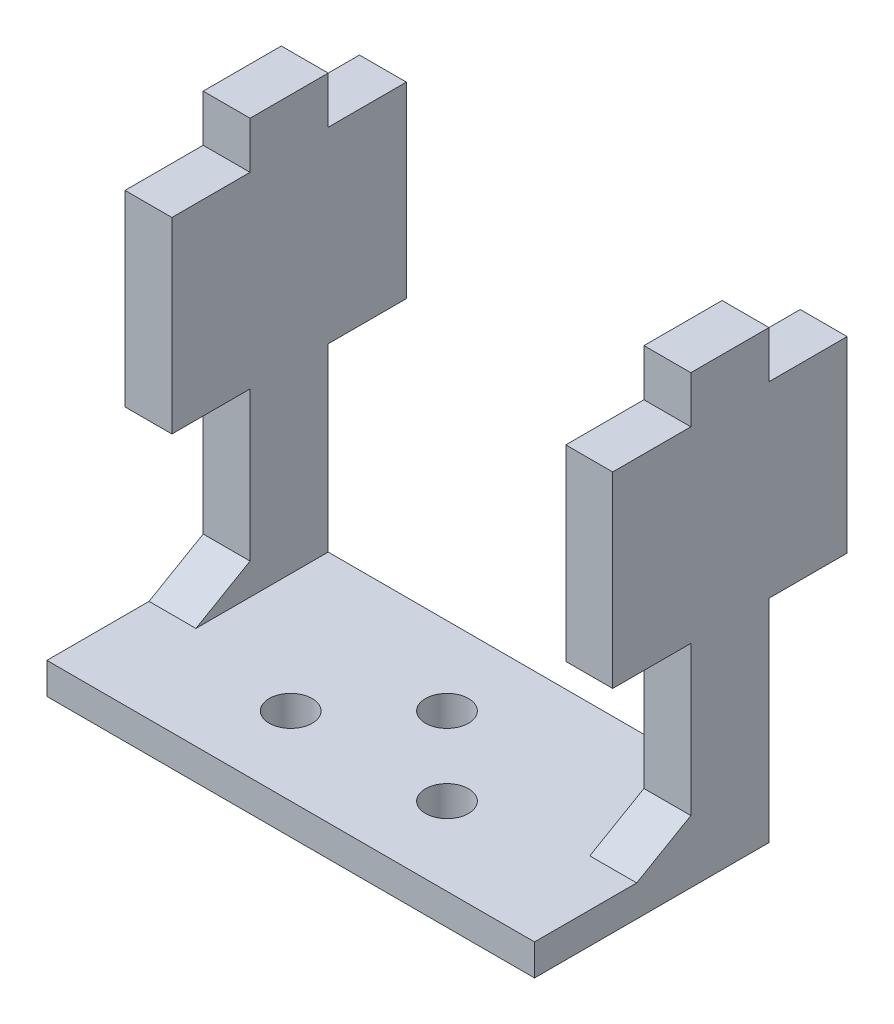
ISO-10303-21;
HEADER;
FILE_DESCRIPTION(('STEP AP214'),'2;1');
FILE_NAME('part.step','',(''),(''),'','','');
FILE_SCHEMA(('AUTOMOTIVE_DESIGN { 1 0 10303 214 1 1 1 1 }'));
ENDSEC;
DATA;
#1=APPLICATION_CONTEXT('core data for automotive mechanical design processes');
#2=APPLICATION_PROTOCOL_DEFINITION('international standard','automotive_design',2000,#1);
#3=PRODUCT_CONTEXT('',#1,'mechanical');
#4=PRODUCT('Part','Part','',(#3));
#5=PRODUCT_RELATED_PRODUCT_CATEGORY('part','',(#4));
#6=PRODUCT_DEFINITION_FORMATION('','',#4);
#7=PRODUCT_DEFINITION_CONTEXT('part definition',#1,'design');
#8=PRODUCT_DEFINITION('design','',#6,#7);
#9=PRODUCT_DEFINITION_SHAPE('','',#8);
#10=(LENGTH_UNIT() NAMED_UNIT(*) SI_UNIT(.MILLI.,.METRE.));
#11=(NAMED_UNIT(*) PLANE_ANGLE_UNIT() SI_UNIT($,.RADIAN.));
#12=(NAMED_UNIT(*) SI_UNIT($,.STERADIAN.) SOLID_ANGLE_UNIT());
#13=UNCERTAINTY_MEASURE_WITH_UNIT(LENGTH_MEASURE(1.E-05),#10,'distance_accuracy_value','');
#14=(GEOMETRIC_REPRESENTATION_CONTEXT(3) GLOBAL_UNCERTAINTY_ASSIGNED_CONTEXT((#13)) GLOBAL_UNIT_ASSIGNED_CONTEXT((#10,
#11,#12)) REPRESENTATION_CONTEXT('',''));
#15=CARTESIAN_POINT('',(0.,0.,0.));
#16=DIRECTION('',(0.,0.,1.));
#17=DIRECTION('',(1.,0.,0.));
#18=AXIS2_PLACEMENT_3D('',#15,#16,#17);
#19=CARTESIAN_POINT('',(0.,2.,0.));
#20=DIRECTION('',(0.,-1.,0.));
#21=DIRECTION('',(0.,0.,-1.));
#22=AXIS2_PLACEMENT_3D('',#19,#20,#21);
#23=PLANE('',#22);
#24=CARTESIAN_POINT('',(20.6,2.,-5.));
#25=DIRECTION('',(0.,1.,0.));
#26=DIRECTION('',(0.,0.,1.));
#27=AXIS2_PLACEMENT_3D('',#24,#25,#26);
#28=CIRCLE('',#27,1.375);
#29=CARTESIAN_POINT('',(20.6,2.,-3.625));
#30=VERTEX_POINT('',#29);
#31=EDGE_CURVE('E252',#30,#30,#28,.T.);
#32=ORIENTED_EDGE('',*,*,#31,.F.);
#33=EDGE_LOOP('',(#32));
#34=FACE_BOUND('',#33,.T.);
#35=CARTESIAN_POINT('',(10.6,2.,-5.));
#36=DIRECTION('',(0.,1.,0.));
#37=DIRECTION('',(0.,0.,1.));
#38=AXIS2_PLACEMENT_3D('',#35,#36,#37);
#39=CIRCLE('',#38,1.375);
#40=CARTESIAN_POINT('',(10.6,2.,-3.625));
#41=VERTEX_POINT('',#40);
#42=EDGE_CURVE('E258',#41,#41,#39,.T.);
#43=ORIENTED_EDGE('',*,*,#42,.F.);
#44=EDGE_LOOP('',(#43));
#45=FACE_BOUND('',#44,.T.);
#46=CARTESIAN_POINT('',(15.6,2.,-10.));
#47=DIRECTION('',(0.,1.,0.));
#48=DIRECTION('',(0.,0.,1.));
#49=AXIS2_PLACEMENT_3D('',#46,#47,#48);
#50=CIRCLE('',#49,1.375);
#51=CARTESIAN_POINT('',(15.6,2.,-8.625));
#52=VERTEX_POINT('',#51);
#53=EDGE_CURVE('E264',#52,#52,#50,.T.);
#54=ORIENTED_EDGE('',*,*,#53,.F.);
#55=EDGE_LOOP('',(#54));
#56=FACE_BOUND('',#55,.T.);
#57=DIRECTION('',(-1.,0.,0.));
#58=VECTOR('',#57,1.);
#59=CARTESIAN_POINT('',(7.00000000000006,2.,-6.53589838486217));
#60=LINE('',#59,#58);
#61=CARTESIAN_POINT('',(3.,2.,-6.53589838486217));
#62=VERTEX_POINT('',#61);
#63=CARTESIAN_POINT('',(0.,2.,-6.53589838486217));
#64=VERTEX_POINT('',#63);
#65=EDGE_CURVE('E229',#62,#64,#60,.T.);
#66=ORIENTED_EDGE('',*,*,#65,.T.);
#67=DIRECTION('',(0.,0.,1.));
#68=VECTOR('',#67,1.);
#69=CARTESIAN_POINT('',(0.,2.,0.));
#70=LINE('',#69,#68);
#71=CARTESIAN_POINT('',(0.,2.,0.));
#72=VERTEX_POINT('',#71);
#73=EDGE_CURVE('E237',#64,#72,#70,.T.);
#74=ORIENTED_EDGE('',*,*,#73,.T.);
#75=DIRECTION('',(1.,0.,0.));
#76=VECTOR('',#75,1.);
#77=CARTESIAN_POINT('',(0.,2.,0.));
#78=LINE('',#77,#76);
#79=CARTESIAN_POINT('',(31.2,2.,0.));
#80=VERTEX_POINT('',#79);
#81=EDGE_CURVE('E271',#72,#80,#78,.T.);
#82=ORIENTED_EDGE('',*,*,#81,.T.);
#83=DIRECTION('',(0.,0.,-1.));
#84=VECTOR('',#83,1.);
#85=CARTESIAN_POINT('',(31.2,2.,0.));
#86=LINE('',#85,#84);
#87=CARTESIAN_POINT('',(31.2,2.,-6.53589838486217));
#88=VERTEX_POINT('',#87);
#89=EDGE_CURVE('E55',#80,#88,#86,.T.);
#90=ORIENTED_EDGE('',*,*,#89,.T.);
#91=DIRECTION('',(1.,0.,0.));
#92=VECTOR('',#91,1.);
#93=CARTESIAN_POINT('',(24.1999999999999,2.,-6.53589838486217));
#94=LINE('',#93,#92);
#95=CARTESIAN_POINT('',(28.2,2.,-6.53589838486217));
#96=VERTEX_POINT('',#95);
#97=EDGE_CURVE('E367',#96,#88,#94,.T.);
#98=ORIENTED_EDGE('',*,*,#97,.F.);
#99=DIRECTION('',(0.,0.,1.));
#100=VECTOR('',#99,1.);
#101=CARTESIAN_POINT('',(28.2,2.,-15.));
#102=LINE('',#101,#100);
#103=CARTESIAN_POINT('',(28.2,2.,-15.));
#104=VERTEX_POINT('',#103);
#105=EDGE_CURVE('E48',#104,#96,#102,.T.);
#106=ORIENTED_EDGE('',*,*,#105,.F.);
#107=DIRECTION('',(-1.,0.,0.));
#108=VECTOR('',#107,1.);
#109=CARTESIAN_POINT('',(0.,2.,-15.));
#110=LINE('',#109,#108);
#111=CARTESIAN_POINT('',(3.,2.,-15.));
#112=VERTEX_POINT('',#111);
#113=EDGE_CURVE('E275',#104,#112,#110,.T.);
#114=ORIENTED_EDGE('',*,*,#113,.T.);
#115=DIRECTION('',(0.,0.,-1.));
#116=VECTOR('',#115,1.);
#117=CARTESIAN_POINT('',(3.,2.,-15.));
#118=LINE('',#117,#116);
#119=EDGE_CURVE('E330',#62,#112,#118,.T.);
#120=ORIENTED_EDGE('',*,*,#119,.F.);
#121=EDGE_LOOP('',(#66,#74,#82,#90,#98,#106,#114,#120));
#122=FACE_BOUND('',#121,.T.);
#123=ADVANCED_FACE('F33',(#34,#45,#56,#122),#23,.F.);
#124=CARTESIAN_POINT('',(0.,28.54,-10.));
#125=DIRECTION('',(0.,0.,-1.));
#126=DIRECTION('',(-1.,0.,0.));
#127=AXIS2_PLACEMENT_3D('',#124,#125,#126);
#128=PLANE('',#127);
#129=DIRECTION('',(-1.,0.,0.));
#130=VECTOR('',#129,1.);
#131=CARTESIAN_POINT('',(7.00000000000006,4.,-10.));
#132=LINE('',#131,#130);
#133=CARTESIAN_POINT('',(3.,4.,-10.));
#134=VERTEX_POINT('',#133);
#135=CARTESIAN_POINT('',(0.,4.,-10.));
#136=VERTEX_POINT('',#135);
#137=EDGE_CURVE('E217',#134,#136,#132,.T.);
#138=ORIENTED_EDGE('',*,*,#137,.F.);
#139=DIRECTION('',(0.,-1.,0.));
#140=VECTOR('',#139,1.);
#141=CARTESIAN_POINT('',(3.,28.54,-10.));
#142=LINE('',#141,#140);
#143=CARTESIAN_POINT('',(3.,13.54,-10.));
#144=VERTEX_POINT('',#143);
#145=EDGE_CURVE('E248',#144,#134,#142,.T.);
#146=ORIENTED_EDGE('',*,*,#145,.F.);
#147=DIRECTION('',(-1.,0.,0.));
#148=VECTOR('',#147,1.);
#149=CARTESIAN_POINT('',(0.,13.54,-10.));
#150=LINE('',#149,#148);
#151=CARTESIAN_POINT('',(0.,13.54,-10.));
#152=VERTEX_POINT('',#151);
#153=EDGE_CURVE('E241',#144,#152,#150,.T.);
#154=ORIENTED_EDGE('',*,*,#153,.T.);
#155=DIRECTION('',(0.,-1.,0.));
#156=VECTOR('',#155,1.);
#157=CARTESIAN_POINT('',(0.,28.54,-10.));
#158=LINE('',#157,#156);
#159=EDGE_CURVE('E235',#152,#136,#158,.T.);
#160=ORIENTED_EDGE('',*,*,#159,.T.);
#161=EDGE_LOOP('',(#138,#146,#154,#160));
#162=FACE_BOUND('',#161,.T.);
#163=ADVANCED_FACE('F240',(#162),#128,.F.);
#164=CARTESIAN_POINT('',(0.,2.,-15.));
#165=DIRECTION('',(0.,0.,1.));
#166=DIRECTION('',(1.,0.,0.));
#167=AXIS2_PLACEMENT_3D('',#164,#165,#166);
#168=PLANE('',#167);
#169=DIRECTION('',(1.,0.,0.));
#170=VECTOR('',#169,1.);
#171=CARTESIAN_POINT('',(0.,25.54,-15.));
#172=LINE('',#171,#170);
#173=CARTESIAN_POINT('',(0.,25.54,-15.));
#174=VERTEX_POINT('',#173);
#175=CARTESIAN_POINT('',(3.,25.54,-15.));
#176=VERTEX_POINT('',#175);
#177=EDGE_CURVE('E410',#174,#176,#172,.T.);
#178=ORIENTED_EDGE('',*,*,#177,.F.);
#179=DIRECTION('',(0.,-1.,0.));
#180=VECTOR('',#179,1.);
#181=CARTESIAN_POINT('',(0.,2.,-15.));
#182=LINE('',#181,#180);
#183=CARTESIAN_POINT('',(0.,28.54,-15.));
#184=VERTEX_POINT('',#183);
#185=EDGE_CURVE('E288',#184,#174,#182,.T.);
#186=ORIENTED_EDGE('',*,*,#185,.F.);
#187=DIRECTION('',(-1.,0.,0.));
#188=VECTOR('',#187,1.);
#189=CARTESIAN_POINT('',(0.,28.54,-15.));
#190=LINE('',#189,#188);
#191=CARTESIAN_POINT('',(3.,28.54,-15.));
#192=VERTEX_POINT('',#191);
#193=EDGE_CURVE('E338',#192,#184,#190,.T.);
#194=ORIENTED_EDGE('',*,*,#193,.F.);
#195=DIRECTION('',(0.,-1.,0.));
#196=VECTOR('',#195,1.);
#197=CARTESIAN_POINT('',(3.,28.54,-15.));
#198=LINE('',#197,#196);
#199=EDGE_CURVE('E343',#192,#176,#198,.T.);
#200=ORIENTED_EDGE('',*,*,#199,.T.);
#201=EDGE_LOOP('',(#178,#186,#194,#200));
#202=FACE_BOUND('',#201,.T.);
#203=ADVANCED_FACE('F485',(#202),#168,.F.);
#204=DIRECTION('',(-1.,0.,0.));
#205=VECTOR('',#204,1.);
#206=CARTESIAN_POINT('',(0.,25.54,-10.));
#207=LINE('',#206,#205);
#208=CARTESIAN_POINT('',(3.,25.54,-10.));
#209=VERTEX_POINT('',#208);
#210=CARTESIAN_POINT('',(0.,25.54,-10.));
#211=VERTEX_POINT('',#210);
#212=EDGE_CURVE('E408',#209,#211,#207,.T.);
#213=ORIENTED_EDGE('',*,*,#212,.F.);
#214=CARTESIAN_POINT('',(3.,28.54,-10.));
#215=VERTEX_POINT('',#214);
#216=EDGE_CURVE('E243',#215,#209,#142,.T.);
#217=ORIENTED_EDGE('',*,*,#216,.F.);
#218=DIRECTION('',(1.,0.,0.));
#219=VECTOR('',#218,1.);
#220=CARTESIAN_POINT('',(0.,28.54,-10.));
#221=LINE('',#220,#219);
#222=CARTESIAN_POINT('',(0.,28.54,-10.));
#223=VERTEX_POINT('',#222);
#224=EDGE_CURVE('E334',#223,#215,#221,.T.);
#225=ORIENTED_EDGE('',*,*,#224,.F.);
#226=EDGE_CURVE('E242',#223,#211,#158,.T.);
#227=ORIENTED_EDGE('',*,*,#226,.T.);
#228=EDGE_LOOP('',(#213,#217,#225,#227));
#229=FACE_BOUND('',#228,.T.);
#230=ADVANCED_FACE('F487',(#229),#128,.F.);
#231=DIRECTION('',(1.,0.,0.));
#232=VECTOR('',#231,1.);
#233=CARTESIAN_POINT('',(0.,25.54,-15.));
#234=LINE('',#233,#232);
#235=CARTESIAN_POINT('',(28.2,25.54,-15.));
#236=VERTEX_POINT('',#235);
#237=CARTESIAN_POINT('',(31.2,25.54,-15.));
#238=VERTEX_POINT('',#237);
#239=EDGE_CURVE('E448',#236,#238,#234,.T.);
#240=ORIENTED_EDGE('',*,*,#239,.F.);
#241=DIRECTION('',(0.,-1.,0.));
#242=VECTOR('',#241,1.);
#243=CARTESIAN_POINT('',(28.2,28.54,-15.));
#244=LINE('',#243,#242);
#245=CARTESIAN_POINT('',(28.2,28.54,-15.));
#246=VERTEX_POINT('',#245);
#247=EDGE_CURVE('E327',#246,#236,#244,.T.);
#248=ORIENTED_EDGE('',*,*,#247,.F.);
#249=DIRECTION('',(-1.,0.,0.));
#250=VECTOR('',#249,1.);
#251=CARTESIAN_POINT('',(31.2,28.54,-15.));
#252=LINE('',#251,#250);
#253=CARTESIAN_POINT('',(31.2,28.54,-15.));
#254=VERTEX_POINT('',#253);
#255=EDGE_CURVE('E453',#254,#246,#252,.T.);
#256=ORIENTED_EDGE('',*,*,#255,.F.);
#257=DIRECTION('',(0.,-1.,0.));
#258=VECTOR('',#257,1.);
#259=CARTESIAN_POINT('',(31.2,2.,-15.));
#260=LINE('',#259,#258);
#261=EDGE_CURVE('E292',#254,#238,#260,.T.);
#262=ORIENTED_EDGE('',*,*,#261,.T.);
#263=EDGE_LOOP('',(#240,#248,#256,#262));
#264=FACE_BOUND('',#263,.T.);
#265=ADVANCED_FACE('F501',(#264),#168,.F.);
#266=CARTESIAN_POINT('',(31.2,28.54,-10.));
#267=DIRECTION('',(0.,0.,-1.));
#268=DIRECTION('',(-1.,0.,0.));
#269=AXIS2_PLACEMENT_3D('',#266,#267,#268);
#270=PLANE('',#269);
#271=DIRECTION('',(-1.,0.,0.));
#272=VECTOR('',#271,1.);
#273=CARTESIAN_POINT('',(31.2,25.54,-10.));
#274=LINE('',#273,#272);
#275=CARTESIAN_POINT('',(31.2,25.54,-10.));
#276=VERTEX_POINT('',#275);
#277=CARTESIAN_POINT('',(28.2,25.54,-10.));
#278=VERTEX_POINT('',#277);
#279=EDGE_CURVE('E11',#276,#278,#274,.T.);
#280=ORIENTED_EDGE('',*,*,#279,.F.);
#281=DIRECTION('',(0.,-1.,0.));
#282=VECTOR('',#281,1.);
#283=CARTESIAN_POINT('',(31.2,28.54,-10.));
#284=LINE('',#283,#282);
#285=CARTESIAN_POINT('',(31.2,28.54,-10.));
#286=VERTEX_POINT('',#285);
#287=EDGE_CURVE('E319',#286,#276,#284,.T.);
#288=ORIENTED_EDGE('',*,*,#287,.F.);
#289=DIRECTION('',(1.,0.,0.));
#290=VECTOR('',#289,1.);
#291=CARTESIAN_POINT('',(31.2,28.54,-10.));
#292=LINE('',#291,#290);
#293=CARTESIAN_POINT('',(28.2,28.54,-10.));
#294=VERTEX_POINT('',#293);
#295=EDGE_CURVE('E457',#294,#286,#292,.T.);
#296=ORIENTED_EDGE('',*,*,#295,.F.);
#297=DIRECTION('',(0.,-1.,0.));
#298=VECTOR('',#297,1.);
#299=CARTESIAN_POINT('',(28.2,28.54,-10.));
#300=LINE('',#299,#298);
#301=EDGE_CURVE('E318',#294,#278,#300,.T.);
#302=ORIENTED_EDGE('',*,*,#301,.T.);
#303=EDGE_LOOP('',(#280,#288,#296,#302));
#304=FACE_BOUND('',#303,.T.);
#305=ADVANCED_FACE('F497',(#304),#270,.F.);
#306=CARTESIAN_POINT('',(0.,0.,0.));
#307=DIRECTION('',(0.,-1.,0.));
#308=DIRECTION('',(0.,0.,-1.));
#309=AXIS2_PLACEMENT_3D('',#306,#307,#308);
#310=PLANE('',#309);
#311=CARTESIAN_POINT('',(10.6,0.,-5.));
#312=DIRECTION('',(0.,1.,0.));
#313=DIRECTION('',(0.,0.,1.));
#314=AXIS2_PLACEMENT_3D('',#311,#312,#313);
#315=CIRCLE('',#314,1.375);
#316=CARTESIAN_POINT('',(10.6,0.,-3.625));
#317=VERTEX_POINT('',#316);
#318=EDGE_CURVE('E255',#317,#317,#315,.T.);
#319=ORIENTED_EDGE('',*,*,#318,.T.);
#320=EDGE_LOOP('',(#319));
#321=FACE_BOUND('',#320,.T.);
#322=DIRECTION('',(0.,0.,1.));
#323=VECTOR('',#322,1.);
#324=CARTESIAN_POINT('',(0.,0.,0.));
#325=LINE('',#324,#323);
#326=CARTESIAN_POINT('',(0.,0.,-15.));
#327=VERTEX_POINT('',#326);
#328=CARTESIAN_POINT('',(0.,0.,0.));
#329=VERTEX_POINT('',#328);
#330=EDGE_CURVE('E267',#327,#329,#325,.T.);
#331=ORIENTED_EDGE('',*,*,#330,.F.);
#332=DIRECTION('',(-1.,0.,0.));
#333=VECTOR('',#332,1.);
#334=CARTESIAN_POINT('',(0.,0.,-15.));
#335=LINE('',#334,#333);
#336=CARTESIAN_POINT('',(31.2,0.,-15.));
#337=VERTEX_POINT('',#336);
#338=EDGE_CURVE('E272',#337,#327,#335,.T.);
#339=ORIENTED_EDGE('',*,*,#338,.F.);
#340=DIRECTION('',(0.,0.,-1.));
#341=VECTOR('',#340,1.);
#342=CARTESIAN_POINT('',(31.2,0.,0.));
#343=LINE('',#342,#341);
#344=CARTESIAN_POINT('',(31.2,0.,0.));
#345=VERTEX_POINT('',#344);
#346=EDGE_CURVE('E283',#345,#337,#343,.T.);
#347=ORIENTED_EDGE('',*,*,#346,.F.);
#348=DIRECTION('',(1.,0.,0.));
#349=VECTOR('',#348,1.);
#350=CARTESIAN_POINT('',(0.,0.,0.));
#351=LINE('',#350,#349);
#352=EDGE_CURVE('E281',#329,#345,#351,.T.);
#353=ORIENTED_EDGE('',*,*,#352,.F.);
#354=EDGE_LOOP('',(#331,#339,#347,#353));
#355=FACE_BOUND('',#354,.T.);
#356=CARTESIAN_POINT('',(15.6,0.,-10.));
#357=DIRECTION('',(0.,1.,0.));
#358=DIRECTION('',(0.,0.,1.));
#359=AXIS2_PLACEMENT_3D('',#356,#357,#358);
#360=CIRCLE('',#359,1.375);
#361=CARTESIAN_POINT('',(15.6,0.,-8.625));
#362=VERTEX_POINT('',#361);
#363=EDGE_CURVE('E261',#362,#362,#360,.T.);
#364=ORIENTED_EDGE('',*,*,#363,.T.);
#365=EDGE_LOOP('',(#364));
#366=FACE_BOUND('',#365,.T.);
#367=CARTESIAN_POINT('',(20.6,0.,-5.));
#368=DIRECTION('',(0.,1.,0.));
#369=DIRECTION('',(0.,0.,1.));
#370=AXIS2_PLACEMENT_3D('',#367,#368,#369);
#371=CIRCLE('',#370,1.375);
#372=CARTESIAN_POINT('',(20.6,0.,-3.625));
#373=VERTEX_POINT('',#372);
#374=EDGE_CURVE('E246',#373,#373,#371,.T.);
#375=ORIENTED_EDGE('',*,*,#374,.T.);
#376=EDGE_LOOP('',(#375));
#377=FACE_BOUND('',#376,.T.);
#378=ADVANCED_FACE('F494',(#321,#355,#366,#377),#310,.T.);
#379=CARTESIAN_POINT('',(0.,2.,0.));
#380=DIRECTION('',(1.,0.,0.));
#381=DIRECTION('',(0.,0.,-1.));
#382=AXIS2_PLACEMENT_3D('',#379,#380,#381);
#383=PLANE('',#382);
#384=ORIENTED_EDGE('',*,*,#73,.F.);
#385=DIRECTION('',(0.,-0.499999999999992,0.866025403784443));
#386=VECTOR('',#385,1.);
#387=CARTESIAN_POINT('',(0.,4.,-10.));
#388=LINE('',#387,#386);
#389=EDGE_CURVE('E221',#136,#64,#388,.T.);
#390=ORIENTED_EDGE('',*,*,#389,.F.);
#391=ORIENTED_EDGE('',*,*,#159,.F.);
#392=DIRECTION('',(0.,0.,-1.));
#393=VECTOR('',#392,1.);
#394=CARTESIAN_POINT('',(0.,13.54,-5.));
#395=LINE('',#394,#393);
#396=CARTESIAN_POINT('',(0.,13.54,-5.));
#397=VERTEX_POINT('',#396);
#398=EDGE_CURVE('E376',#397,#152,#395,.T.);
#399=ORIENTED_EDGE('',*,*,#398,.F.);
#400=DIRECTION('',(0.,-1.,0.));
#401=VECTOR('',#400,1.);
#402=CARTESIAN_POINT('',(0.,2.,-5.));
#403=LINE('',#402,#401);
#404=CARTESIAN_POINT('',(0.,25.54,-5.));
#405=VERTEX_POINT('',#404);
#406=EDGE_CURVE('E386',#405,#397,#403,.T.);
#407=ORIENTED_EDGE('',*,*,#406,.F.);
#408=DIRECTION('',(0.,0.,-1.));
#409=VECTOR('',#408,1.);
#410=CARTESIAN_POINT('',(0.,25.54,-5.));
#411=LINE('',#410,#409);
#412=EDGE_CURVE('E379',#405,#211,#411,.T.);
#413=ORIENTED_EDGE('',*,*,#412,.T.);
#414=ORIENTED_EDGE('',*,*,#226,.F.);
#415=DIRECTION('',(0.,0.,1.));
#416=VECTOR('',#415,1.);
#417=CARTESIAN_POINT('',(0.,28.54,-15.));
#418=LINE('',#417,#416);
#419=EDGE_CURVE('E331',#184,#223,#418,.T.);
#420=ORIENTED_EDGE('',*,*,#419,.F.);
#421=ORIENTED_EDGE('',*,*,#185,.T.);
#422=CARTESIAN_POINT('',(0.,25.54,-20.));
#423=VERTEX_POINT('',#422);
#424=EDGE_CURVE('E382',#174,#423,#411,.T.);
#425=ORIENTED_EDGE('',*,*,#424,.T.);
#426=DIRECTION('',(0.,-1.,0.));
#427=VECTOR('',#426,1.);
#428=CARTESIAN_POINT('',(0.,2.,-20.));
#429=LINE('',#428,#427);
#430=CARTESIAN_POINT('',(0.,13.54,-20.));
#431=VERTEX_POINT('',#430);
#432=EDGE_CURVE('E397',#423,#431,#429,.T.);
#433=ORIENTED_EDGE('',*,*,#432,.T.);
#434=CARTESIAN_POINT('',(0.,13.54,-15.));
#435=VERTEX_POINT('',#434);
#436=EDGE_CURVE('E378',#435,#431,#395,.T.);
#437=ORIENTED_EDGE('',*,*,#436,.F.);
#438=EDGE_CURVE('E278',#435,#327,#182,.T.);
#439=ORIENTED_EDGE('',*,*,#438,.T.);
#440=ORIENTED_EDGE('',*,*,#330,.T.);
#441=DIRECTION('',(0.,-1.,0.));
#442=VECTOR('',#441,1.);
#443=CARTESIAN_POINT('',(0.,2.,0.));
#444=LINE('',#443,#442);
#445=EDGE_CURVE('E298',#72,#329,#444,.T.);
#446=ORIENTED_EDGE('',*,*,#445,.F.);
#447=EDGE_LOOP('',(#384,#390,#391,#399,#407,#413,#414,#420,#421,#425,#433,#437,#439,#440,#446));
#448=FACE_BOUND('',#447,.T.);
#449=ADVANCED_FACE('F35',(#448),#383,.F.);
#450=CARTESIAN_POINT('',(0.,2.,0.));
#451=DIRECTION('',(0.,0.,-1.));
#452=DIRECTION('',(-1.,0.,0.));
#453=AXIS2_PLACEMENT_3D('',#450,#451,#452);
#454=PLANE('',#453);
#455=ORIENTED_EDGE('',*,*,#352,.T.);
#456=DIRECTION('',(0.,-1.,0.));
#457=VECTOR('',#456,1.);
#458=CARTESIAN_POINT('',(31.2,2.,0.));
#459=LINE('',#458,#457);
#460=EDGE_CURVE('E295',#80,#345,#459,.T.);
#461=ORIENTED_EDGE('',*,*,#460,.F.);
#462=ORIENTED_EDGE('',*,*,#81,.F.);
#463=ORIENTED_EDGE('',*,*,#445,.T.);
#464=EDGE_LOOP('',(#455,#461,#462,#463));
#465=FACE_BOUND('',#464,.T.);
#466=ADVANCED_FACE('F503',(#465),#454,.F.);
#467=CARTESIAN_POINT('',(31.2,2.,0.));
#468=DIRECTION('',(-1.,0.,0.));
#469=DIRECTION('',(0.,0.,1.));
#470=AXIS2_PLACEMENT_3D('',#467,#468,#469);
#471=PLANE('',#470);
#472=CARTESIAN_POINT('',(31.2,13.54,-15.));
#473=VERTEX_POINT('',#472);
#474=EDGE_CURVE('E291',#473,#337,#260,.T.);
#475=ORIENTED_EDGE('',*,*,#474,.F.);
#476=DIRECTION('',(0.,0.,-1.));
#477=VECTOR('',#476,1.);
#478=CARTESIAN_POINT('',(31.2,13.54,-5.));
#479=LINE('',#478,#477);
#480=CARTESIAN_POINT('',(31.2,13.54,-20.));
#481=VERTEX_POINT('',#480);
#482=EDGE_CURVE('E433',#473,#481,#479,.T.);
#483=ORIENTED_EDGE('',*,*,#482,.T.);
#484=DIRECTION('',(0.,-1.,0.));
#485=VECTOR('',#484,1.);
#486=CARTESIAN_POINT('',(31.2,2.00000000000001,-20.));
#487=LINE('',#486,#485);
#488=CARTESIAN_POINT('',(31.2,25.54,-20.));
#489=VERTEX_POINT('',#488);
#490=EDGE_CURVE('E412',#489,#481,#487,.T.);
#491=ORIENTED_EDGE('',*,*,#490,.F.);
#492=DIRECTION('',(0.,0.,-1.));
#493=VECTOR('',#492,1.);
#494=CARTESIAN_POINT('',(31.2,25.54,-5.));
#495=LINE('',#494,#493);
#496=EDGE_CURVE('E437',#238,#489,#495,.T.);
#497=ORIENTED_EDGE('',*,*,#496,.F.);
#498=ORIENTED_EDGE('',*,*,#261,.F.);
#499=DIRECTION('',(0.,0.,-1.));
#500=VECTOR('',#499,1.);
#501=CARTESIAN_POINT('',(31.2,28.54,-15.));
#502=LINE('',#501,#500);
#503=EDGE_CURVE('E450',#286,#254,#502,.T.);
#504=ORIENTED_EDGE('',*,*,#503,.F.);
#505=ORIENTED_EDGE('',*,*,#287,.T.);
#506=CARTESIAN_POINT('',(31.2,25.54,-5.));
#507=VERTEX_POINT('',#506);
#508=EDGE_CURVE('E434',#507,#276,#495,.T.);
#509=ORIENTED_EDGE('',*,*,#508,.F.);
#510=DIRECTION('',(0.,-1.,0.));
#511=VECTOR('',#510,1.);
#512=CARTESIAN_POINT('',(31.2,2.00000000000001,-5.));
#513=LINE('',#512,#511);
#514=CARTESIAN_POINT('',(31.2,13.54,-5.));
#515=VERTEX_POINT('',#514);
#516=EDGE_CURVE('E424',#507,#515,#513,.T.);
#517=ORIENTED_EDGE('',*,*,#516,.T.);
#518=CARTESIAN_POINT('',(31.2,13.54,-10.));
#519=VERTEX_POINT('',#518);
#520=EDGE_CURVE('E444',#515,#519,#479,.T.);
#521=ORIENTED_EDGE('',*,*,#520,.T.);
#522=CARTESIAN_POINT('',(31.2,4.,-10.));
#523=VERTEX_POINT('',#522);
#524=EDGE_CURVE('E307',#519,#523,#284,.T.);
#525=ORIENTED_EDGE('',*,*,#524,.T.);
#526=DIRECTION('',(0.,-0.499999999999992,0.866025403784443));
#527=VECTOR('',#526,1.);
#528=CARTESIAN_POINT('',(31.2,4.,-10.));
#529=LINE('',#528,#527);
#530=EDGE_CURVE('E360',#523,#88,#529,.T.);
#531=ORIENTED_EDGE('',*,*,#530,.T.);
#532=ORIENTED_EDGE('',*,*,#89,.F.);
#533=ORIENTED_EDGE('',*,*,#460,.T.);
#534=ORIENTED_EDGE('',*,*,#346,.T.);
#535=EDGE_LOOP('',(#475,#483,#491,#497,#498,#504,#505,#509,#517,#521,#525,#531,#532,#533,#534));
#536=FACE_BOUND('',#535,.T.);
#537=ADVANCED_FACE('F464',(#536),#471,.F.);
#538=ORIENTED_EDGE('',*,*,#438,.F.);
#539=DIRECTION('',(1.,0.,0.));
#540=VECTOR('',#539,1.);
#541=CARTESIAN_POINT('',(0.,13.54,-15.));
#542=LINE('',#541,#540);
#543=CARTESIAN_POINT('',(3.,13.54,-15.));
#544=VERTEX_POINT('',#543);
#545=EDGE_CURVE('E356',#435,#544,#542,.T.);
#546=ORIENTED_EDGE('',*,*,#545,.T.);
#547=EDGE_CURVE('E341',#544,#112,#198,.T.);
#548=ORIENTED_EDGE('',*,*,#547,.T.);
#549=ORIENTED_EDGE('',*,*,#113,.F.);
#550=CARTESIAN_POINT('',(28.2,13.54,-15.));
#551=VERTEX_POINT('',#550);
#552=EDGE_CURVE('E322',#551,#104,#244,.T.);
#553=ORIENTED_EDGE('',*,*,#552,.F.);
#554=DIRECTION('',(1.,0.,0.));
#555=VECTOR('',#554,1.);
#556=CARTESIAN_POINT('',(0.,13.54,-15.));
#557=LINE('',#556,#555);
#558=EDGE_CURVE('E436',#551,#473,#557,.T.);
#559=ORIENTED_EDGE('',*,*,#558,.T.);
#560=ORIENTED_EDGE('',*,*,#474,.T.);
#561=ORIENTED_EDGE('',*,*,#338,.T.);
#562=EDGE_LOOP('',(#538,#546,#548,#549,#553,#559,#560,#561));
#563=FACE_BOUND('',#562,.T.);
#564=ADVANCED_FACE('F354',(#563),#168,.F.);
#565=CARTESIAN_POINT('',(15.6,2.,-10.));
#566=DIRECTION('',(0.,-1.,0.));
#567=DIRECTION('',(0.,0.,-1.));
#568=AXIS2_PLACEMENT_3D('',#565,#566,#567);
#569=CYLINDRICAL_SURFACE('',#568,1.375);
#570=ORIENTED_EDGE('',*,*,#53,.T.);
#571=EDGE_LOOP('',(#570));
#572=FACE_BOUND('',#571,.T.);
#573=ORIENTED_EDGE('',*,*,#363,.F.);
#574=EDGE_LOOP('',(#573));
#575=FACE_BOUND('',#574,.T.);
#576=ADVANCED_FACE('F492',(#572,#575),#569,.F.);
#577=CARTESIAN_POINT('',(10.6,2.,-5.));
#578=DIRECTION('',(0.,-1.,0.));
#579=DIRECTION('',(0.,0.,-1.));
#580=AXIS2_PLACEMENT_3D('',#577,#578,#579);
#581=CYLINDRICAL_SURFACE('',#580,1.375);
#582=ORIENTED_EDGE('',*,*,#42,.T.);
#583=EDGE_LOOP('',(#582));
#584=FACE_BOUND('',#583,.T.);
#585=ORIENTED_EDGE('',*,*,#318,.F.);
#586=EDGE_LOOP('',(#585));
#587=FACE_BOUND('',#586,.T.);
#588=ADVANCED_FACE('F629',(#584,#587),#581,.F.);
#589=CARTESIAN_POINT('',(20.6,2.,-5.));
#590=DIRECTION('',(0.,-1.,0.));
#591=DIRECTION('',(0.,0.,-1.));
#592=AXIS2_PLACEMENT_3D('',#589,#590,#591);
#593=CYLINDRICAL_SURFACE('',#592,1.375);
#594=ORIENTED_EDGE('',*,*,#31,.T.);
#595=EDGE_LOOP('',(#594));
#596=FACE_BOUND('',#595,.T.);
#597=ORIENTED_EDGE('',*,*,#374,.F.);
#598=EDGE_LOOP('',(#597));
#599=FACE_BOUND('',#598,.T.);
#600=ADVANCED_FACE('F626',(#596,#599),#593,.F.);
#601=CARTESIAN_POINT('',(3.,28.54,-15.));
#602=DIRECTION('',(-1.,0.,0.));
#603=DIRECTION('',(0.,0.,1.));
#604=AXIS2_PLACEMENT_3D('',#601,#602,#603);
#605=PLANE('',#604);
#606=ORIENTED_EDGE('',*,*,#547,.F.);
#607=DIRECTION('',(0.,0.,-1.));
#608=VECTOR('',#607,1.);
#609=CARTESIAN_POINT('',(3.,13.54,-5.));
#610=LINE('',#609,#608);
#611=CARTESIAN_POINT('',(3.,13.54,-20.));
#612=VERTEX_POINT('',#611);
#613=EDGE_CURVE('E375',#544,#612,#610,.T.);
#614=ORIENTED_EDGE('',*,*,#613,.T.);
#615=DIRECTION('',(0.,-1.,0.));
#616=VECTOR('',#615,1.);
#617=CARTESIAN_POINT('',(3.,2.,-20.));
#618=LINE('',#617,#616);
#619=CARTESIAN_POINT('',(3.,25.54,-20.));
#620=VERTEX_POINT('',#619);
#621=EDGE_CURVE('E403',#620,#612,#618,.T.);
#622=ORIENTED_EDGE('',*,*,#621,.F.);
#623=DIRECTION('',(0.,0.,-1.));
#624=VECTOR('',#623,1.);
#625=CARTESIAN_POINT('',(3.,25.54,-5.));
#626=LINE('',#625,#624);
#627=EDGE_CURVE('E371',#176,#620,#626,.T.);
#628=ORIENTED_EDGE('',*,*,#627,.F.);
#629=ORIENTED_EDGE('',*,*,#199,.F.);
#630=DIRECTION('',(0.,0.,-1.));
#631=VECTOR('',#630,1.);
#632=CARTESIAN_POINT('',(3.,28.54,-15.));
#633=LINE('',#632,#631);
#634=EDGE_CURVE('E336',#215,#192,#633,.T.);
#635=ORIENTED_EDGE('',*,*,#634,.F.);
#636=ORIENTED_EDGE('',*,*,#216,.T.);
#637=CARTESIAN_POINT('',(3.,25.54,-5.));
#638=VERTEX_POINT('',#637);
#639=EDGE_CURVE('E383',#638,#209,#626,.T.);
#640=ORIENTED_EDGE('',*,*,#639,.F.);
#641=DIRECTION('',(0.,-1.,0.));
#642=VECTOR('',#641,1.);
#643=CARTESIAN_POINT('',(3.,2.,-5.));
#644=LINE('',#643,#642);
#645=CARTESIAN_POINT('',(3.,13.54,-5.));
#646=VERTEX_POINT('',#645);
#647=EDGE_CURVE('E391',#638,#646,#644,.T.);
#648=ORIENTED_EDGE('',*,*,#647,.T.);
#649=EDGE_CURVE('E372',#646,#144,#610,.T.);
#650=ORIENTED_EDGE('',*,*,#649,.T.);
#651=ORIENTED_EDGE('',*,*,#145,.T.);
#652=DIRECTION('',(0.,0.499999999999992,-0.866025403784443));
#653=VECTOR('',#652,1.);
#654=CARTESIAN_POINT('',(3.,4.,-10.));
#655=LINE('',#654,#653);
#656=EDGE_CURVE('E224',#62,#134,#655,.T.);
#657=ORIENTED_EDGE('',*,*,#656,.F.);
#658=ORIENTED_EDGE('',*,*,#119,.T.);
#659=EDGE_LOOP('',(#606,#614,#622,#628,#629,#635,#636,#640,#648,#650,#651,#657,#658));
#660=FACE_BOUND('',#659,.T.);
#661=ADVANCED_FACE('F358',(#660),#605,.F.);
#662=CARTESIAN_POINT('',(0.,28.54,0.));
#663=DIRECTION('',(0.,1.,0.));
#664=DIRECTION('',(0.,0.,1.));
#665=AXIS2_PLACEMENT_3D('',#662,#663,#664);
#666=PLANE('',#665);
#667=ORIENTED_EDGE('',*,*,#419,.T.);
#668=ORIENTED_EDGE('',*,*,#224,.T.);
#669=ORIENTED_EDGE('',*,*,#634,.T.);
#670=ORIENTED_EDGE('',*,*,#193,.T.);
#671=EDGE_LOOP('',(#667,#668,#669,#670));
#672=FACE_BOUND('',#671,.T.);
#673=ADVANCED_FACE('F596',(#672),#666,.T.);
#674=CARTESIAN_POINT('',(28.2,28.54,-15.));
#675=DIRECTION('',(1.,0.,0.));
#676=DIRECTION('',(0.,0.,-1.));
#677=AXIS2_PLACEMENT_3D('',#674,#675,#676);
#678=PLANE('',#677);
#679=CARTESIAN_POINT('',(28.2,13.54,-10.));
#680=VERTEX_POINT('',#679);
#681=CARTESIAN_POINT('',(28.2,4.,-10.));
#682=VERTEX_POINT('',#681);
#683=EDGE_CURVE('E305',#680,#682,#300,.T.);
#684=ORIENTED_EDGE('',*,*,#683,.F.);
#685=DIRECTION('',(0.,0.,-1.));
#686=VECTOR('',#685,1.);
#687=CARTESIAN_POINT('',(28.2,13.54,-5.));
#688=LINE('',#687,#686);
#689=CARTESIAN_POINT('',(28.2,13.54,-5.));
#690=VERTEX_POINT('',#689);
#691=EDGE_CURVE('E313',#690,#680,#688,.T.);
#692=ORIENTED_EDGE('',*,*,#691,.F.);
#693=DIRECTION('',(0.,-1.,0.));
#694=VECTOR('',#693,1.);
#695=CARTESIAN_POINT('',(28.2,2.,-5.));
#696=LINE('',#695,#694);
#697=CARTESIAN_POINT('',(28.2,25.54,-5.));
#698=VERTEX_POINT('',#697);
#699=EDGE_CURVE('E429',#698,#690,#696,.T.);
#700=ORIENTED_EDGE('',*,*,#699,.F.);
#701=DIRECTION('',(0.,0.,-1.));
#702=VECTOR('',#701,1.);
#703=CARTESIAN_POINT('',(28.2,25.54,-5.));
#704=LINE('',#703,#702);
#705=EDGE_CURVE('E438',#698,#278,#704,.T.);
#706=ORIENTED_EDGE('',*,*,#705,.T.);
#707=ORIENTED_EDGE('',*,*,#301,.F.);
#708=DIRECTION('',(0.,0.,1.));
#709=VECTOR('',#708,1.);
#710=CARTESIAN_POINT('',(28.2,28.54,-15.));
#711=LINE('',#710,#709);
#712=EDGE_CURVE('E455',#246,#294,#711,.T.);
#713=ORIENTED_EDGE('',*,*,#712,.F.);
#714=ORIENTED_EDGE('',*,*,#247,.T.);
#715=CARTESIAN_POINT('',(28.2,25.54,-20.));
#716=VERTEX_POINT('',#715);
#717=EDGE_CURVE('E441',#236,#716,#704,.T.);
#718=ORIENTED_EDGE('',*,*,#717,.T.);
#719=DIRECTION('',(0.,-1.,0.));
#720=VECTOR('',#719,1.);
#721=CARTESIAN_POINT('',(28.2,2.,-20.));
#722=LINE('',#721,#720);
#723=CARTESIAN_POINT('',(28.2,13.54,-20.));
#724=VERTEX_POINT('',#723);
#725=EDGE_CURVE('E418',#716,#724,#722,.T.);
#726=ORIENTED_EDGE('',*,*,#725,.T.);
#727=EDGE_CURVE('E443',#551,#724,#688,.T.);
#728=ORIENTED_EDGE('',*,*,#727,.F.);
#729=ORIENTED_EDGE('',*,*,#552,.T.);
#730=ORIENTED_EDGE('',*,*,#105,.T.);
#731=DIRECTION('',(0.,0.499999999999992,-0.866025403784443));
#732=VECTOR('',#731,1.);
#733=CARTESIAN_POINT('',(28.2,4.,-10.));
#734=LINE('',#733,#732);
#735=EDGE_CURVE('E316',#96,#682,#734,.T.);
#736=ORIENTED_EDGE('',*,*,#735,.T.);
#737=EDGE_LOOP('',(#684,#692,#700,#706,#707,#713,#714,#718,#726,#728,#729,#730,#736));
#738=FACE_BOUND('',#737,.T.);
#739=ADVANCED_FACE('F311',(#738),#678,.F.);
#740=ORIENTED_EDGE('',*,*,#683,.T.);
#741=DIRECTION('',(1.,0.,0.));
#742=VECTOR('',#741,1.);
#743=CARTESIAN_POINT('',(24.1999999999999,4.,-10.));
#744=LINE('',#743,#742);
#745=EDGE_CURVE('E366',#682,#523,#744,.T.);
#746=ORIENTED_EDGE('',*,*,#745,.T.);
#747=ORIENTED_EDGE('',*,*,#524,.F.);
#748=DIRECTION('',(-1.,0.,0.));
#749=VECTOR('',#748,1.);
#750=CARTESIAN_POINT('',(31.2,13.54,-10.));
#751=LINE('',#750,#749);
#752=EDGE_CURVE('E41',#519,#680,#751,.T.);
#753=ORIENTED_EDGE('',*,*,#752,.T.);
#754=EDGE_LOOP('',(#740,#746,#747,#753));
#755=FACE_BOUND('',#754,.T.);
#756=ADVANCED_FACE('F304',(#755),#270,.F.);
#757=CARTESIAN_POINT('',(0.,28.54,0.));
#758=DIRECTION('',(0.,-1.,0.));
#759=DIRECTION('',(0.,0.,-1.));
#760=AXIS2_PLACEMENT_3D('',#757,#758,#759);
#761=PLANE('',#760);
#762=ORIENTED_EDGE('',*,*,#503,.T.);
#763=ORIENTED_EDGE('',*,*,#255,.T.);
#764=ORIENTED_EDGE('',*,*,#712,.T.);
#765=ORIENTED_EDGE('',*,*,#295,.T.);
#766=EDGE_LOOP('',(#762,#763,#764,#765));
#767=FACE_BOUND('',#766,.T.);
#768=ADVANCED_FACE('F534',(#767),#761,.F.);
#769=CARTESIAN_POINT('',(0.,0.,-5.));
#770=DIRECTION('',(0.,0.,-1.));
#771=DIRECTION('',(-1.,0.,0.));
#772=AXIS2_PLACEMENT_3D('',#769,#770,#771);
#773=PLANE('',#772);
#774=ORIENTED_EDGE('',*,*,#516,.F.);
#775=DIRECTION('',(-1.,0.,0.));
#776=VECTOR('',#775,1.);
#777=CARTESIAN_POINT('',(0.,25.54,-5.));
#778=LINE('',#777,#776);
#779=EDGE_CURVE('E431',#507,#698,#778,.T.);
#780=ORIENTED_EDGE('',*,*,#779,.T.);
#781=ORIENTED_EDGE('',*,*,#699,.T.);
#782=DIRECTION('',(-1.,0.,0.));
#783=VECTOR('',#782,1.);
#784=CARTESIAN_POINT('',(0.,13.54,-5.));
#785=LINE('',#784,#783);
#786=EDGE_CURVE('E427',#515,#690,#785,.T.);
#787=ORIENTED_EDGE('',*,*,#786,.F.);
#788=EDGE_LOOP('',(#774,#780,#781,#787));
#789=FACE_BOUND('',#788,.T.);
#790=ADVANCED_FACE('F545',(#789),#773,.F.);
#791=CARTESIAN_POINT('',(0.,13.54,-5.));
#792=DIRECTION('',(0.,-1.,0.));
#793=DIRECTION('',(1.,0.,0.));
#794=AXIS2_PLACEMENT_3D('',#791,#792,#793);
#795=PLANE('',#794);
#796=ORIENTED_EDGE('',*,*,#752,.F.);
#797=ORIENTED_EDGE('',*,*,#520,.F.);
#798=ORIENTED_EDGE('',*,*,#786,.T.);
#799=ORIENTED_EDGE('',*,*,#691,.T.);
#800=EDGE_LOOP('',(#796,#797,#798,#799));
#801=FACE_BOUND('',#800,.T.);
#802=ADVANCED_FACE('F546',(#801),#795,.T.);
#803=CARTESIAN_POINT('',(0.,25.54,-5.));
#804=DIRECTION('',(0.,-1.,0.));
#805=DIRECTION('',(0.,0.,-1.));
#806=AXIS2_PLACEMENT_3D('',#803,#804,#805);
#807=PLANE('',#806);
#808=ORIENTED_EDGE('',*,*,#508,.T.);
#809=ORIENTED_EDGE('',*,*,#279,.T.);
#810=ORIENTED_EDGE('',*,*,#705,.F.);
#811=ORIENTED_EDGE('',*,*,#779,.F.);
#812=EDGE_LOOP('',(#808,#809,#810,#811));
#813=FACE_BOUND('',#812,.T.);
#814=ADVANCED_FACE('F541',(#813),#807,.F.);
#815=ORIENTED_EDGE('',*,*,#717,.F.);
#816=ORIENTED_EDGE('',*,*,#239,.T.);
#817=ORIENTED_EDGE('',*,*,#496,.T.);
#818=DIRECTION('',(-1.,0.,0.));
#819=VECTOR('',#818,1.);
#820=CARTESIAN_POINT('',(0.,25.54,-20.));
#821=LINE('',#820,#819);
#822=EDGE_CURVE('E421',#489,#716,#821,.T.);
#823=ORIENTED_EDGE('',*,*,#822,.T.);
#824=EDGE_LOOP('',(#815,#816,#817,#823));
#825=FACE_BOUND('',#824,.T.);
#826=ADVANCED_FACE('F527',(#825),#807,.F.);
#827=ORIENTED_EDGE('',*,*,#558,.F.);
#828=ORIENTED_EDGE('',*,*,#727,.T.);
#829=DIRECTION('',(-1.,0.,0.));
#830=VECTOR('',#829,1.);
#831=CARTESIAN_POINT('',(0.,13.54,-20.));
#832=LINE('',#831,#830);
#833=EDGE_CURVE('E415',#481,#724,#832,.T.);
#834=ORIENTED_EDGE('',*,*,#833,.F.);
#835=ORIENTED_EDGE('',*,*,#482,.F.);
#836=EDGE_LOOP('',(#827,#828,#834,#835));
#837=FACE_BOUND('',#836,.T.);
#838=ADVANCED_FACE('F521',(#837),#795,.T.);
#839=CARTESIAN_POINT('',(0.,0.,-20.));
#840=DIRECTION('',(0.,0.,-1.));
#841=DIRECTION('',(-1.,0.,0.));
#842=AXIS2_PLACEMENT_3D('',#839,#840,#841);
#843=PLANE('',#842);
#844=ORIENTED_EDGE('',*,*,#490,.T.);
#845=ORIENTED_EDGE('',*,*,#833,.T.);
#846=ORIENTED_EDGE('',*,*,#725,.F.);
#847=ORIENTED_EDGE('',*,*,#822,.F.);
#848=EDGE_LOOP('',(#844,#845,#846,#847));
#849=FACE_BOUND('',#848,.T.);
#850=ADVANCED_FACE('F525',(#849),#843,.T.);
#851=CARTESIAN_POINT('',(0.,0.,-5.));
#852=DIRECTION('',(0.,0.,-1.));
#853=DIRECTION('',(-1.,0.,0.));
#854=AXIS2_PLACEMENT_3D('',#851,#852,#853);
#855=PLANE('',#854);
#856=ORIENTED_EDGE('',*,*,#647,.F.);
#857=DIRECTION('',(-1.,0.,0.));
#858=VECTOR('',#857,1.);
#859=CARTESIAN_POINT('',(0.,25.54,-5.));
#860=LINE('',#859,#858);
#861=EDGE_CURVE('E374',#638,#405,#860,.T.);
#862=ORIENTED_EDGE('',*,*,#861,.T.);
#863=ORIENTED_EDGE('',*,*,#406,.T.);
#864=DIRECTION('',(-1.,0.,0.));
#865=VECTOR('',#864,1.);
#866=CARTESIAN_POINT('',(0.,13.54,-5.));
#867=LINE('',#866,#865);
#868=EDGE_CURVE('E388',#646,#397,#867,.T.);
#869=ORIENTED_EDGE('',*,*,#868,.F.);
#870=EDGE_LOOP('',(#856,#862,#863,#869));
#871=FACE_BOUND('',#870,.T.);
#872=ADVANCED_FACE('F561',(#871),#855,.F.);
#873=CARTESIAN_POINT('',(0.,13.54,-5.));
#874=DIRECTION('',(0.,-1.,0.));
#875=DIRECTION('',(0.,0.,-1.));
#876=AXIS2_PLACEMENT_3D('',#873,#874,#875);
#877=PLANE('',#876);
#878=ORIENTED_EDGE('',*,*,#153,.F.);
#879=ORIENTED_EDGE('',*,*,#649,.F.);
#880=ORIENTED_EDGE('',*,*,#868,.T.);
#881=ORIENTED_EDGE('',*,*,#398,.T.);
#882=EDGE_LOOP('',(#878,#879,#880,#881));
#883=FACE_BOUND('',#882,.T.);
#884=ADVANCED_FACE('F568',(#883),#877,.T.);
#885=CARTESIAN_POINT('',(0.,25.54,-5.));
#886=DIRECTION('',(0.,-1.,0.));
#887=DIRECTION('',(0.,0.,-1.));
#888=AXIS2_PLACEMENT_3D('',#885,#886,#887);
#889=PLANE('',#888);
#890=ORIENTED_EDGE('',*,*,#639,.T.);
#891=ORIENTED_EDGE('',*,*,#212,.T.);
#892=ORIENTED_EDGE('',*,*,#412,.F.);
#893=ORIENTED_EDGE('',*,*,#861,.F.);
#894=EDGE_LOOP('',(#890,#891,#892,#893));
#895=FACE_BOUND('',#894,.T.);
#896=ADVANCED_FACE('F572',(#895),#889,.F.);
#897=ORIENTED_EDGE('',*,*,#424,.F.);
#898=ORIENTED_EDGE('',*,*,#177,.T.);
#899=ORIENTED_EDGE('',*,*,#627,.T.);
#900=DIRECTION('',(-1.,0.,0.));
#901=VECTOR('',#900,1.);
#902=CARTESIAN_POINT('',(0.,25.54,-20.));
#903=LINE('',#902,#901);
#904=EDGE_CURVE('E394',#620,#423,#903,.T.);
#905=ORIENTED_EDGE('',*,*,#904,.T.);
#906=EDGE_LOOP('',(#897,#898,#899,#905));
#907=FACE_BOUND('',#906,.T.);
#908=ADVANCED_FACE('F570',(#907),#889,.F.);
#909=ORIENTED_EDGE('',*,*,#545,.F.);
#910=ORIENTED_EDGE('',*,*,#436,.T.);
#911=DIRECTION('',(-1.,0.,0.));
#912=VECTOR('',#911,1.);
#913=CARTESIAN_POINT('',(0.,13.54,-20.));
#914=LINE('',#913,#912);
#915=EDGE_CURVE('E400',#612,#431,#914,.T.);
#916=ORIENTED_EDGE('',*,*,#915,.F.);
#917=ORIENTED_EDGE('',*,*,#613,.F.);
#918=EDGE_LOOP('',(#909,#910,#916,#917));
#919=FACE_BOUND('',#918,.T.);
#920=ADVANCED_FACE('F475',(#919),#877,.T.);
#921=CARTESIAN_POINT('',(0.,0.,-20.));
#922=DIRECTION('',(0.,0.,-1.));
#923=DIRECTION('',(-1.,0.,0.));
#924=AXIS2_PLACEMENT_3D('',#921,#922,#923);
#925=PLANE('',#924);
#926=ORIENTED_EDGE('',*,*,#621,.T.);
#927=ORIENTED_EDGE('',*,*,#915,.T.);
#928=ORIENTED_EDGE('',*,*,#432,.F.);
#929=ORIENTED_EDGE('',*,*,#904,.F.);
#930=EDGE_LOOP('',(#926,#927,#928,#929));
#931=FACE_BOUND('',#930,.T.);
#932=ADVANCED_FACE('F468',(#931),#925,.T.);
#933=CARTESIAN_POINT('',(24.1999999999999,4.,-10.));
#934=DIRECTION('',(0.,0.866025403784443,0.499999999999992));
#935=DIRECTION('',(0.,-0.499999999999992,0.866025403784443));
#936=AXIS2_PLACEMENT_3D('',#933,#934,#935);
#937=PLANE('',#936);
#938=ORIENTED_EDGE('',*,*,#735,.F.);
#939=ORIENTED_EDGE('',*,*,#97,.T.);
#940=ORIENTED_EDGE('',*,*,#530,.F.);
#941=ORIENTED_EDGE('',*,*,#745,.F.);
#942=EDGE_LOOP('',(#938,#939,#940,#941));
#943=FACE_BOUND('',#942,.T.);
#944=ADVANCED_FACE('F466',(#943),#937,.T.);
#945=CARTESIAN_POINT('',(7.00000000000006,4.,-10.));
#946=DIRECTION('',(0.,-0.866025403784443,-0.499999999999992));
#947=DIRECTION('',(0.,0.499999999999992,-0.866025403784443));
#948=AXIS2_PLACEMENT_3D('',#945,#946,#947);
#949=PLANE('',#948);
#950=ORIENTED_EDGE('',*,*,#65,.F.);
#951=ORIENTED_EDGE('',*,*,#656,.T.);
#952=ORIENTED_EDGE('',*,*,#137,.T.);
#953=ORIENTED_EDGE('',*,*,#389,.T.);
#954=EDGE_LOOP('',(#950,#951,#952,#953));
#955=FACE_BOUND('',#954,.T.);
#956=ADVANCED_FACE('F220',(#955),#949,.F.);
#957=CLOSED_SHELL('',(#123,#163,#203,#230,#265,#305,#378,#449,#466,#537,#564,#576,#588,#600,
#661,#673,#739,#756,#768,#790,#802,#814,#826,#838,#850,#872,#884,#896,#908,#920,#932,#944,#956));
#958=MANIFOLD_SOLID_BREP('B2',#957);
#959=ADVANCED_BREP_SHAPE_REPRESENTATION('',(#18,#958),#14);
#960=SHAPE_DEFINITION_REPRESENTATION(#9,#959);
ENDSEC;
END-ISO-10303-21;
